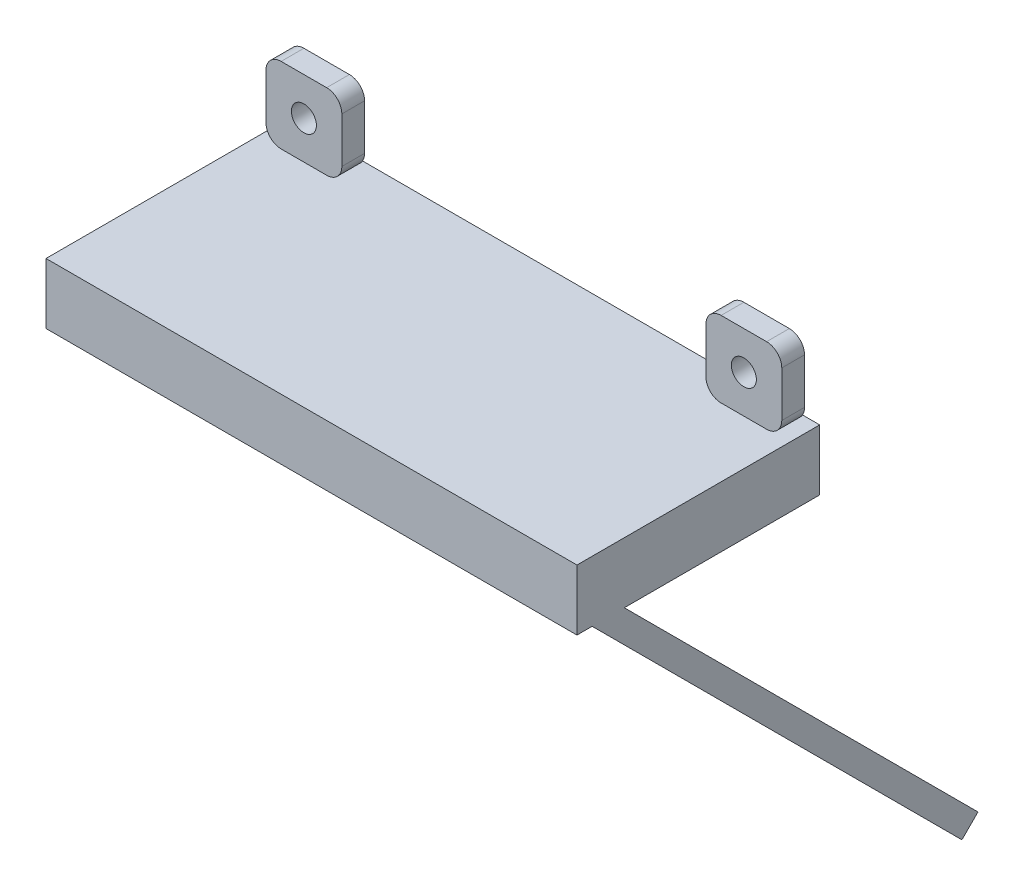
ISO-10303-21;
HEADER;
FILE_DESCRIPTION(('STEP AP214'),'2;1');
FILE_NAME('part.step','',(''),(''),'','','');
FILE_SCHEMA(('AUTOMOTIVE_DESIGN { 1 0 10303 214 1 1 1 1 }'));
ENDSEC;
DATA;
#1=APPLICATION_CONTEXT('core data for automotive mechanical design processes');
#2=APPLICATION_PROTOCOL_DEFINITION('international standard','automotive_design',2000,#1);
#3=PRODUCT_CONTEXT('',#1,'mechanical');
#4=PRODUCT('Part','Part','',(#3));
#5=PRODUCT_RELATED_PRODUCT_CATEGORY('part','',(#4));
#6=PRODUCT_DEFINITION_FORMATION('','',#4);
#7=PRODUCT_DEFINITION_CONTEXT('part definition',#1,'design');
#8=PRODUCT_DEFINITION('design','',#6,#7);
#9=PRODUCT_DEFINITION_SHAPE('','',#8);
#10=(LENGTH_UNIT() NAMED_UNIT(*) SI_UNIT(.MILLI.,.METRE.));
#11=(NAMED_UNIT(*) PLANE_ANGLE_UNIT() SI_UNIT($,.RADIAN.));
#12=(NAMED_UNIT(*) SI_UNIT($,.STERADIAN.) SOLID_ANGLE_UNIT());
#13=UNCERTAINTY_MEASURE_WITH_UNIT(LENGTH_MEASURE(1.E-05),#10,'distance_accuracy_value','');
#14=(GEOMETRIC_REPRESENTATION_CONTEXT(3) GLOBAL_UNCERTAINTY_ASSIGNED_CONTEXT((#13)) GLOBAL_UNIT_ASSIGNED_CONTEXT((#10,
#11,#12)) REPRESENTATION_CONTEXT('',''));
#15=CARTESIAN_POINT('',(0.,0.,0.));
#16=DIRECTION('',(0.,0.,1.));
#17=DIRECTION('',(1.,0.,0.));
#18=AXIS2_PLACEMENT_3D('',#15,#16,#17);
#19=CARTESIAN_POINT('',(-35.,-36.,34.));
#20=DIRECTION('',(0.,1.,0.));
#21=DIRECTION('',(0.,0.,1.));
#22=AXIS2_PLACEMENT_3D('',#19,#20,#21);
#23=PLANE('',#22);
#24=CARTESIAN_POINT('',(18.,-36.,17.9411254969543));
#25=DIRECTION('',(0.,1.,0.));
#26=DIRECTION('',(0.,0.,-1.));
#27=AXIS2_PLACEMENT_3D('',#24,#25,#26);
#28=ELLIPSE('',#27,4.52548339959391,3.2);
#29=CARTESIAN_POINT('',(20.5440188295439,-36.,20.6862915010153));
#30=VERTEX_POINT('',#29);
#31=CARTESIAN_POINT('',(15.4559811704561,-36.,20.6862915010153));
#32=VERTEX_POINT('',#31);
#33=EDGE_CURVE('E215',#30,#32,#28,.F.);
#34=ORIENTED_EDGE('',*,*,#33,.F.);
#35=DIRECTION('',(1.,0.,0.));
#36=VECTOR('',#35,1.);
#37=CARTESIAN_POINT('',(-35.,-36.,20.6862915010153));
#38=LINE('',#37,#36);
#39=EDGE_CURVE('E211',#32,#30,#38,.T.);
#40=ORIENTED_EDGE('',*,*,#39,.F.);
#41=EDGE_LOOP('',(#34,#40));
#42=FACE_BOUND('',#41,.T.);
#43=DIRECTION('',(0.,0.,-1.));
#44=VECTOR('',#43,1.);
#45=CARTESIAN_POINT('',(35.,-36.,34.));
#46=LINE('',#45,#44);
#47=CARTESIAN_POINT('',(35.,-36.,27.7573593128807));
#48=VERTEX_POINT('',#47);
#49=CARTESIAN_POINT('',(35.,-36.,2.));
#50=VERTEX_POINT('',#49);
#51=EDGE_CURVE('E271',#48,#50,#46,.T.);
#52=ORIENTED_EDGE('',*,*,#51,.F.);
#53=DIRECTION('',(-1.,0.,0.));
#54=VECTOR('',#53,1.);
#55=CARTESIAN_POINT('',(35.,-36.,27.7573593128807));
#56=LINE('',#55,#54);
#57=CARTESIAN_POINT('',(-35.,-36.,27.7573593128807));
#58=VERTEX_POINT('',#57);
#59=EDGE_CURVE('E255',#48,#58,#56,.T.);
#60=ORIENTED_EDGE('',*,*,#59,.T.);
#61=DIRECTION('',(0.,0.,-1.));
#62=VECTOR('',#61,1.);
#63=CARTESIAN_POINT('',(-35.,-36.,34.));
#64=LINE('',#63,#62);
#65=CARTESIAN_POINT('',(-35.,-36.,2.));
#66=VERTEX_POINT('',#65);
#67=EDGE_CURVE('E268',#58,#66,#64,.T.);
#68=ORIENTED_EDGE('',*,*,#67,.T.);
#69=DIRECTION('',(1.,0.,0.));
#70=VECTOR('',#69,1.);
#71=CARTESIAN_POINT('',(-35.,-36.,2.));
#72=LINE('',#71,#70);
#73=EDGE_CURVE('E284',#66,#50,#72,.T.);
#74=ORIENTED_EDGE('',*,*,#73,.T.);
#75=EDGE_LOOP('',(#52,#60,#68,#74));
#76=FACE_BOUND('',#75,.T.);
#77=CARTESIAN_POINT('',(-18.,-36.,17.9411254969543));
#78=DIRECTION('',(0.,1.,0.));
#79=DIRECTION('',(0.,0.,-1.));
#80=AXIS2_PLACEMENT_3D('',#77,#78,#79);
#81=ELLIPSE('',#80,4.5254833995939,3.2);
#82=CARTESIAN_POINT('',(-15.4559811704561,-36.,20.6862915010153));
#83=VERTEX_POINT('',#82);
#84=CARTESIAN_POINT('',(-20.5440188295439,-36.,20.6862915010153));
#85=VERTEX_POINT('',#84);
#86=EDGE_CURVE('E11',#83,#85,#81,.F.);
#87=ORIENTED_EDGE('',*,*,#86,.F.);
#88=DIRECTION('',(1.,0.,0.));
#89=VECTOR('',#88,1.);
#90=CARTESIAN_POINT('',(-35.,-36.,20.6862915010153));
#91=LINE('',#90,#89);
#92=EDGE_CURVE('E49',#85,#83,#91,.T.);
#93=ORIENTED_EDGE('',*,*,#92,.F.);
#94=EDGE_LOOP('',(#87,#93));
#95=FACE_BOUND('',#94,.T.);
#96=ADVANCED_FACE('F41',(#42,#76,#95),#23,.F.);
#97=CARTESIAN_POINT('',(35.,-28.,34.));
#98=DIRECTION('',(0.,-1.,0.));
#99=DIRECTION('',(0.,0.,-1.));
#100=AXIS2_PLACEMENT_3D('',#97,#98,#99);
#101=PLANE('',#100);
#102=DIRECTION('',(0.,0.,-1.));
#103=VECTOR('',#102,1.);
#104=CARTESIAN_POINT('',(-32.,-28.,6.));
#105=LINE('',#104,#103);
#106=CARTESIAN_POINT('',(-32.,-28.,6.));
#107=VERTEX_POINT('',#106);
#108=CARTESIAN_POINT('',(-32.,-28.,3.));
#109=VERTEX_POINT('',#108);
#110=EDGE_CURVE('E290',#107,#109,#105,.T.);
#111=ORIENTED_EDGE('',*,*,#110,.T.);
#112=DIRECTION('',(1.,0.,0.));
#113=VECTOR('',#112,1.);
#114=CARTESIAN_POINT('',(-32.,-28.,3.));
#115=LINE('',#114,#113);
#116=CARTESIAN_POINT('',(-26.,-28.,3.));
#117=VERTEX_POINT('',#116);
#118=EDGE_CURVE('E334',#109,#117,#115,.T.);
#119=ORIENTED_EDGE('',*,*,#118,.T.);
#120=DIRECTION('',(0.,0.,-1.));
#121=VECTOR('',#120,1.);
#122=CARTESIAN_POINT('',(-26.,-28.,6.));
#123=LINE('',#122,#121);
#124=CARTESIAN_POINT('',(-26.,-28.,6.));
#125=VERTEX_POINT('',#124);
#126=EDGE_CURVE('E300',#125,#117,#123,.T.);
#127=ORIENTED_EDGE('',*,*,#126,.F.);
#128=DIRECTION('',(1.,0.,0.));
#129=VECTOR('',#128,1.);
#130=CARTESIAN_POINT('',(-32.,-28.,6.));
#131=LINE('',#130,#129);
#132=EDGE_CURVE('E352',#107,#125,#131,.T.);
#133=ORIENTED_EDGE('',*,*,#132,.F.);
#134=EDGE_LOOP('',(#111,#119,#127,#133));
#135=FACE_BOUND('',#134,.T.);
#136=DIRECTION('',(-1.,0.,0.));
#137=VECTOR('',#136,1.);
#138=CARTESIAN_POINT('',(35.,-28.,2.));
#139=LINE('',#138,#137);
#140=CARTESIAN_POINT('',(35.,-28.,2.));
#141=VERTEX_POINT('',#140);
#142=CARTESIAN_POINT('',(-35.,-28.,2.));
#143=VERTEX_POINT('',#142);
#144=EDGE_CURVE('E279',#141,#143,#139,.T.);
#145=ORIENTED_EDGE('',*,*,#144,.T.);
#146=DIRECTION('',(0.,0.,-1.));
#147=VECTOR('',#146,1.);
#148=CARTESIAN_POINT('',(-35.,-28.,34.));
#149=LINE('',#148,#147);
#150=CARTESIAN_POINT('',(-35.,-28.,34.));
#151=VERTEX_POINT('',#150);
#152=EDGE_CURVE('E275',#151,#143,#149,.T.);
#153=ORIENTED_EDGE('',*,*,#152,.F.);
#154=DIRECTION('',(-1.,0.,0.));
#155=VECTOR('',#154,1.);
#156=CARTESIAN_POINT('',(35.,-28.,34.));
#157=LINE('',#156,#155);
#158=CARTESIAN_POINT('',(35.,-28.,34.));
#159=VERTEX_POINT('',#158);
#160=EDGE_CURVE('E278',#159,#151,#157,.T.);
#161=ORIENTED_EDGE('',*,*,#160,.F.);
#162=DIRECTION('',(0.,0.,-1.));
#163=VECTOR('',#162,1.);
#164=CARTESIAN_POINT('',(35.,-28.,34.));
#165=LINE('',#164,#163);
#166=EDGE_CURVE('E272',#159,#141,#165,.T.);
#167=ORIENTED_EDGE('',*,*,#166,.T.);
#168=EDGE_LOOP('',(#145,#153,#161,#167));
#169=FACE_BOUND('',#168,.T.);
#170=DIRECTION('',(0.,0.,-1.));
#171=VECTOR('',#170,1.);
#172=CARTESIAN_POINT('',(26.,-28.,6.));
#173=LINE('',#172,#171);
#174=CARTESIAN_POINT('',(26.,-28.,6.));
#175=VERTEX_POINT('',#174);
#176=CARTESIAN_POINT('',(26.,-28.,3.));
#177=VERTEX_POINT('',#176);
#178=EDGE_CURVE('E359',#175,#177,#173,.T.);
#179=ORIENTED_EDGE('',*,*,#178,.T.);
#180=DIRECTION('',(1.,0.,0.));
#181=VECTOR('',#180,1.);
#182=CARTESIAN_POINT('',(26.,-28.,3.));
#183=LINE('',#182,#181);
#184=CARTESIAN_POINT('',(32.,-28.,3.));
#185=VERTEX_POINT('',#184);
#186=EDGE_CURVE('E398',#177,#185,#183,.T.);
#187=ORIENTED_EDGE('',*,*,#186,.T.);
#188=DIRECTION('',(0.,0.,-1.));
#189=VECTOR('',#188,1.);
#190=CARTESIAN_POINT('',(32.,-28.,6.));
#191=LINE('',#190,#189);
#192=CARTESIAN_POINT('',(32.,-28.,6.));
#193=VERTEX_POINT('',#192);
#194=EDGE_CURVE('E364',#193,#185,#191,.T.);
#195=ORIENTED_EDGE('',*,*,#194,.F.);
#196=DIRECTION('',(1.,0.,0.));
#197=VECTOR('',#196,1.);
#198=CARTESIAN_POINT('',(26.,-28.,6.));
#199=LINE('',#198,#197);
#200=EDGE_CURVE('E416',#175,#193,#199,.T.);
#201=ORIENTED_EDGE('',*,*,#200,.F.);
#202=EDGE_LOOP('',(#179,#187,#195,#201));
#203=FACE_BOUND('',#202,.T.);
#204=ADVANCED_FACE('F457',(#135,#169,#203),#101,.F.);
#205=CARTESIAN_POINT('',(35.,-33.1299423149112,30.6274169979695));
#206=DIRECTION('',(0.,-0.707106781186548,0.707106781186548));
#207=DIRECTION('',(0.,-0.707106781186548,-0.707106781186548));
#208=AXIS2_PLACEMENT_3D('',#205,#206,#207);
#209=PLANE('',#208);
#210=CARTESIAN_POINT('',(-18.,-40.9081169079632,22.8492424049175));
#211=DIRECTION('',(0.,-0.707106781186548,0.707106781186548));
#212=DIRECTION('',(0.,-0.707106781186548,-0.707106781186548));
#213=AXIS2_PLACEMENT_3D('',#210,#211,#212);
#214=CIRCLE('',#213,1.65);
#215=CARTESIAN_POINT('',(-18.,-42.074843096921,21.6825162159597));
#216=VERTEX_POINT('',#215);
#217=EDGE_CURVE('E227',#216,#216,#214,.T.);
#218=ORIENTED_EDGE('',*,*,#217,.T.);
#219=EDGE_LOOP('',(#218));
#220=FACE_BOUND('',#219,.T.);
#221=CARTESIAN_POINT('',(18.,-74.8492424049175,-11.0918830920368));
#222=DIRECTION('',(0.,-0.707106781186548,0.707106781186548));
#223=DIRECTION('',(0.,-0.707106781186548,-0.707106781186548));
#224=AXIS2_PLACEMENT_3D('',#221,#222,#223);
#225=CIRCLE('',#224,1.65);
#226=CARTESIAN_POINT('',(18.,-76.0159685938753,-12.2586092809946));
#227=VERTEX_POINT('',#226);
#228=EDGE_CURVE('E228',#227,#227,#225,.T.);
#229=ORIENTED_EDGE('',*,*,#228,.T.);
#230=EDGE_LOOP('',(#229));
#231=FACE_BOUND('',#230,.T.);
#232=CARTESIAN_POINT('',(18.,-40.9081169079632,22.8492424049175));
#233=DIRECTION('',(0.,-0.707106781186548,0.707106781186548));
#234=DIRECTION('',(0.,-0.707106781186548,-0.707106781186548));
#235=AXIS2_PLACEMENT_3D('',#232,#233,#234);
#236=CIRCLE('',#235,1.65);
#237=CARTESIAN_POINT('',(18.,-42.074843096921,21.6825162159597));
#238=VERTEX_POINT('',#237);
#239=EDGE_CURVE('E232',#238,#238,#236,.T.);
#240=ORIENTED_EDGE('',*,*,#239,.T.);
#241=EDGE_LOOP('',(#240));
#242=FACE_BOUND('',#241,.T.);
#243=CARTESIAN_POINT('',(-18.,-74.8492424049175,-11.0918830920368));
#244=DIRECTION('',(0.,-0.707106781186548,0.707106781186548));
#245=DIRECTION('',(0.,-0.707106781186548,-0.707106781186548));
#246=AXIS2_PLACEMENT_3D('',#243,#244,#245);
#247=CIRCLE('',#246,1.65);
#248=CARTESIAN_POINT('',(-18.,-76.0159685938753,-12.2586092809946));
#249=VERTEX_POINT('',#248);
#250=EDGE_CURVE('E236',#249,#249,#247,.T.);
#251=ORIENTED_EDGE('',*,*,#250,.T.);
#252=EDGE_LOOP('',(#251));
#253=FACE_BOUND('',#252,.T.);
#254=ORIENTED_EDGE('',*,*,#59,.F.);
#255=DIRECTION('',(0.,0.707106781186548,0.707106781186548));
#256=VECTOR('',#255,1.);
#257=CARTESIAN_POINT('',(35.,-33.1299423149112,30.6274169979695));
#258=LINE('',#257,#256);
#259=CARTESIAN_POINT('',(35.,-82.6274169979695,-18.8700576850888));
#260=VERTEX_POINT('',#259);
#261=EDGE_CURVE('E257',#260,#48,#258,.T.);
#262=ORIENTED_EDGE('',*,*,#261,.F.);
#263=DIRECTION('',(-1.,0.,0.));
#264=VECTOR('',#263,1.);
#265=CARTESIAN_POINT('',(35.,-82.6274169979695,-18.8700576850888));
#266=LINE('',#265,#264);
#267=CARTESIAN_POINT('',(-35.,-82.6274169979695,-18.8700576850888));
#268=VERTEX_POINT('',#267);
#269=EDGE_CURVE('E216',#260,#268,#266,.T.);
#270=ORIENTED_EDGE('',*,*,#269,.T.);
#271=DIRECTION('',(0.,0.707106781186548,0.707106781186548));
#272=VECTOR('',#271,1.);
#273=CARTESIAN_POINT('',(-35.,-33.1299423149112,30.6274169979695));
#274=LINE('',#273,#272);
#275=EDGE_CURVE('E249',#268,#58,#274,.T.);
#276=ORIENTED_EDGE('',*,*,#275,.T.);
#277=EDGE_LOOP('',(#254,#262,#270,#276));
#278=FACE_BOUND('',#277,.T.);
#279=ADVANCED_FACE('F435',(#220,#231,#242,#253,#278),#209,.F.);
#280=CARTESIAN_POINT('',(35.,-84.7487373415292,-16.7487373415292));
#281=DIRECTION('',(0.,0.707106781186548,-0.707106781186548));
#282=DIRECTION('',(0.,0.707106781186548,0.707106781186548));
#283=AXIS2_PLACEMENT_3D('',#280,#281,#282);
#284=PLANE('',#283);
#285=CARTESIAN_POINT('',(-18.,-43.0294372515229,24.9705627484771));
#286=DIRECTION('',(0.,0.707106781186548,-0.707106781186548));
#287=DIRECTION('',(0.,0.707106781186548,0.707106781186548));
#288=AXIS2_PLACEMENT_3D('',#285,#286,#287);
#289=CIRCLE('',#288,1.65);
#290=CARTESIAN_POINT('',(-18.,-41.8627110625651,26.1372889374349));
#291=VERTEX_POINT('',#290);
#292=EDGE_CURVE('E224',#291,#291,#289,.T.);
#293=ORIENTED_EDGE('',*,*,#292,.T.);
#294=EDGE_LOOP('',(#293));
#295=FACE_BOUND('',#294,.T.);
#296=CARTESIAN_POINT('',(18.,-76.9705627484771,-8.97056274847713));
#297=DIRECTION('',(0.,0.707106781186548,-0.707106781186548));
#298=DIRECTION('',(0.,0.707106781186548,0.707106781186548));
#299=AXIS2_PLACEMENT_3D('',#296,#297,#298);
#300=CIRCLE('',#299,1.65);
#301=CARTESIAN_POINT('',(18.,-75.8038365595193,-7.80383655951933));
#302=VERTEX_POINT('',#301);
#303=EDGE_CURVE('E229',#302,#302,#300,.T.);
#304=ORIENTED_EDGE('',*,*,#303,.T.);
#305=EDGE_LOOP('',(#304));
#306=FACE_BOUND('',#305,.T.);
#307=CARTESIAN_POINT('',(18.,-43.0294372515229,24.9705627484771));
#308=DIRECTION('',(0.,0.707106781186548,-0.707106781186548));
#309=DIRECTION('',(0.,0.707106781186548,0.707106781186548));
#310=AXIS2_PLACEMENT_3D('',#307,#308,#309);
#311=CIRCLE('',#310,1.65);
#312=CARTESIAN_POINT('',(18.,-41.8627110625651,26.1372889374349));
#313=VERTEX_POINT('',#312);
#314=EDGE_CURVE('E233',#313,#313,#311,.T.);
#315=ORIENTED_EDGE('',*,*,#314,.T.);
#316=EDGE_LOOP('',(#315));
#317=FACE_BOUND('',#316,.T.);
#318=CARTESIAN_POINT('',(-18.,-76.9705627484771,-8.97056274847713));
#319=DIRECTION('',(0.,0.707106781186548,-0.707106781186548));
#320=DIRECTION('',(0.,0.707106781186548,0.707106781186548));
#321=AXIS2_PLACEMENT_3D('',#318,#319,#320);
#322=CIRCLE('',#321,1.65);
#323=CARTESIAN_POINT('',(-18.,-75.8038365595193,-7.80383655951933));
#324=VERTEX_POINT('',#323);
#325=EDGE_CURVE('E237',#324,#324,#322,.T.);
#326=ORIENTED_EDGE('',*,*,#325,.T.);
#327=EDGE_LOOP('',(#326));
#328=FACE_BOUND('',#327,.T.);
#329=DIRECTION('',(1.,0.,0.));
#330=VECTOR('',#329,1.);
#331=CARTESIAN_POINT('',(35.,-36.,32.));
#332=LINE('',#331,#330);
#333=CARTESIAN_POINT('',(-35.,-36.,32.));
#334=VERTEX_POINT('',#333);
#335=CARTESIAN_POINT('',(35.,-36.,32.));
#336=VERTEX_POINT('',#335);
#337=EDGE_CURVE('E263',#334,#336,#332,.T.);
#338=ORIENTED_EDGE('',*,*,#337,.F.);
#339=DIRECTION('',(0.,-0.707106781186548,-0.707106781186548));
#340=VECTOR('',#339,1.);
#341=CARTESIAN_POINT('',(-35.,-84.7487373415292,-16.7487373415292));
#342=LINE('',#341,#340);
#343=CARTESIAN_POINT('',(-35.,-84.7487373415292,-16.7487373415292));
#344=VERTEX_POINT('',#343);
#345=EDGE_CURVE('E246',#334,#344,#342,.T.);
#346=ORIENTED_EDGE('',*,*,#345,.T.);
#347=DIRECTION('',(-1.,0.,0.));
#348=VECTOR('',#347,1.);
#349=CARTESIAN_POINT('',(35.,-84.7487373415292,-16.7487373415292));
#350=LINE('',#349,#348);
#351=CARTESIAN_POINT('',(35.,-84.7487373415292,-16.7487373415292));
#352=VERTEX_POINT('',#351);
#353=EDGE_CURVE('E242',#352,#344,#350,.T.);
#354=ORIENTED_EDGE('',*,*,#353,.F.);
#355=DIRECTION('',(0.,-0.707106781186548,-0.707106781186548));
#356=VECTOR('',#355,1.);
#357=CARTESIAN_POINT('',(35.,-84.7487373415292,-16.7487373415292));
#358=LINE('',#357,#356);
#359=EDGE_CURVE('E245',#336,#352,#358,.T.);
#360=ORIENTED_EDGE('',*,*,#359,.F.);
#361=EDGE_LOOP('',(#338,#346,#354,#360));
#362=FACE_BOUND('',#361,.T.);
#363=ADVANCED_FACE('F487',(#295,#306,#317,#328,#362),#284,.F.);
#364=CARTESIAN_POINT('',(35.,-82.6274169979695,-18.8700576850888));
#365=DIRECTION('',(0.,0.707106781186546,0.707106781186549));
#366=DIRECTION('',(0.,-0.707106781186549,0.707106781186546));
#367=AXIS2_PLACEMENT_3D('',#364,#365,#366);
#368=PLANE('',#367);
#369=DIRECTION('',(0.,0.707106781186549,-0.707106781186546));
#370=VECTOR('',#369,1.);
#371=CARTESIAN_POINT('',(-35.,-82.6274169979695,-18.8700576850888));
#372=LINE('',#371,#370);
#373=EDGE_CURVE('E252',#344,#268,#372,.T.);
#374=ORIENTED_EDGE('',*,*,#373,.T.);
#375=ORIENTED_EDGE('',*,*,#269,.F.);
#376=DIRECTION('',(0.,0.707106781186549,-0.707106781186546));
#377=VECTOR('',#376,1.);
#378=CARTESIAN_POINT('',(35.,-82.6274169979695,-18.8700576850888));
#379=LINE('',#378,#377);
#380=EDGE_CURVE('E248',#352,#260,#379,.T.);
#381=ORIENTED_EDGE('',*,*,#380,.F.);
#382=ORIENTED_EDGE('',*,*,#353,.T.);
#383=EDGE_LOOP('',(#374,#375,#381,#382));
#384=FACE_BOUND('',#383,.T.);
#385=ADVANCED_FACE('F43',(#384),#368,.F.);
#386=CARTESIAN_POINT('',(35.,0.,0.));
#387=DIRECTION('',(-1.,0.,0.));
#388=DIRECTION('',(0.,0.,1.));
#389=AXIS2_PLACEMENT_3D('',#386,#387,#388);
#390=PLANE('',#389);
#391=ORIENTED_EDGE('',*,*,#261,.T.);
#392=ORIENTED_EDGE('',*,*,#51,.T.);
#393=DIRECTION('',(0.,1.,0.));
#394=VECTOR('',#393,1.);
#395=CARTESIAN_POINT('',(35.,-36.,2.));
#396=LINE('',#395,#394);
#397=EDGE_CURVE('E282',#50,#141,#396,.T.);
#398=ORIENTED_EDGE('',*,*,#397,.T.);
#399=ORIENTED_EDGE('',*,*,#166,.F.);
#400=DIRECTION('',(0.,1.,0.));
#401=VECTOR('',#400,1.);
#402=CARTESIAN_POINT('',(35.,-36.,34.));
#403=LINE('',#402,#401);
#404=CARTESIAN_POINT('',(35.,-36.,34.));
#405=VERTEX_POINT('',#404);
#406=EDGE_CURVE('E292',#405,#159,#403,.T.);
#407=ORIENTED_EDGE('',*,*,#406,.F.);
#408=EDGE_CURVE('E269',#405,#336,#46,.T.);
#409=ORIENTED_EDGE('',*,*,#408,.T.);
#410=ORIENTED_EDGE('',*,*,#359,.T.);
#411=ORIENTED_EDGE('',*,*,#380,.T.);
#412=EDGE_LOOP('',(#391,#392,#398,#399,#407,#409,#410,#411));
#413=FACE_BOUND('',#412,.T.);
#414=ADVANCED_FACE('F477',(#413),#390,.F.);
#415=CARTESIAN_POINT('',(-35.,0.,0.));
#416=DIRECTION('',(-1.,0.,0.));
#417=DIRECTION('',(0.,0.,1.));
#418=AXIS2_PLACEMENT_3D('',#415,#416,#417);
#419=PLANE('',#418);
#420=ORIENTED_EDGE('',*,*,#67,.F.);
#421=ORIENTED_EDGE('',*,*,#275,.F.);
#422=ORIENTED_EDGE('',*,*,#373,.F.);
#423=ORIENTED_EDGE('',*,*,#345,.F.);
#424=CARTESIAN_POINT('',(-35.,-36.,34.));
#425=VERTEX_POINT('',#424);
#426=EDGE_CURVE('E266',#425,#334,#64,.T.);
#427=ORIENTED_EDGE('',*,*,#426,.F.);
#428=DIRECTION('',(0.,-1.,0.));
#429=VECTOR('',#428,1.);
#430=CARTESIAN_POINT('',(-35.,-28.,34.));
#431=LINE('',#430,#429);
#432=EDGE_CURVE('E281',#151,#425,#431,.T.);
#433=ORIENTED_EDGE('',*,*,#432,.F.);
#434=ORIENTED_EDGE('',*,*,#152,.T.);
#435=DIRECTION('',(0.,-1.,0.));
#436=VECTOR('',#435,1.);
#437=CARTESIAN_POINT('',(-35.,-28.,2.));
#438=LINE('',#437,#436);
#439=EDGE_CURVE('E287',#143,#66,#438,.T.);
#440=ORIENTED_EDGE('',*,*,#439,.T.);
#441=EDGE_LOOP('',(#420,#421,#422,#423,#427,#433,#434,#440));
#442=FACE_BOUND('',#441,.T.);
#443=ADVANCED_FACE('F468',(#442),#419,.T.);
#444=ORIENTED_EDGE('',*,*,#426,.T.);
#445=ORIENTED_EDGE('',*,*,#337,.T.);
#446=ORIENTED_EDGE('',*,*,#408,.F.);
#447=DIRECTION('',(1.,0.,0.));
#448=VECTOR('',#447,1.);
#449=CARTESIAN_POINT('',(-35.,-36.,34.));
#450=LINE('',#449,#448);
#451=EDGE_CURVE('E294',#425,#405,#450,.T.);
#452=ORIENTED_EDGE('',*,*,#451,.F.);
#453=EDGE_LOOP('',(#444,#445,#446,#452));
#454=FACE_BOUND('',#453,.T.);
#455=ADVANCED_FACE('F459',(#454),#23,.F.);
#456=CARTESIAN_POINT('',(0.,0.,34.));
#457=DIRECTION('',(0.,0.,1.));
#458=DIRECTION('',(1.,0.,0.));
#459=AXIS2_PLACEMENT_3D('',#456,#457,#458);
#460=PLANE('',#459);
#461=ORIENTED_EDGE('',*,*,#432,.T.);
#462=ORIENTED_EDGE('',*,*,#451,.T.);
#463=ORIENTED_EDGE('',*,*,#406,.T.);
#464=ORIENTED_EDGE('',*,*,#160,.T.);
#465=EDGE_LOOP('',(#461,#462,#463,#464));
#466=FACE_BOUND('',#465,.T.);
#467=ADVANCED_FACE('F467',(#466),#460,.T.);
#468=CARTESIAN_POINT('',(0.,0.,2.));
#469=DIRECTION('',(0.,0.,1.));
#470=DIRECTION('',(1.,0.,0.));
#471=AXIS2_PLACEMENT_3D('',#468,#469,#470);
#472=PLANE('',#471);
#473=ORIENTED_EDGE('',*,*,#439,.F.);
#474=ORIENTED_EDGE('',*,*,#144,.F.);
#475=ORIENTED_EDGE('',*,*,#397,.F.);
#476=ORIENTED_EDGE('',*,*,#73,.F.);
#477=EDGE_LOOP('',(#473,#474,#475,#476));
#478=FACE_BOUND('',#477,.T.);
#479=ADVANCED_FACE('F474',(#478),#472,.F.);
#480=CARTESIAN_POINT('',(-32.,-26.,6.));
#481=DIRECTION('',(0.,0.,1.));
#482=DIRECTION('',(1.,0.,0.));
#483=AXIS2_PLACEMENT_3D('',#480,#481,#482);
#484=PLANE('',#483);
#485=CARTESIAN_POINT('',(-32.,-26.,6.));
#486=DIRECTION('',(0.,0.,1.));
#487=DIRECTION('',(1.,0.,0.));
#488=AXIS2_PLACEMENT_3D('',#485,#486,#487);
#489=CIRCLE('',#488,2.);
#490=CARTESIAN_POINT('',(-34.,-26.,6.));
#491=VERTEX_POINT('',#490);
#492=EDGE_CURVE('E323',#491,#107,#489,.T.);
#493=ORIENTED_EDGE('',*,*,#492,.T.);
#494=ORIENTED_EDGE('',*,*,#132,.T.);
#495=CARTESIAN_POINT('',(-26.,-26.,6.));
#496=DIRECTION('',(0.,0.,1.));
#497=DIRECTION('',(1.,0.,0.));
#498=AXIS2_PLACEMENT_3D('',#495,#496,#497);
#499=CIRCLE('',#498,2.);
#500=CARTESIAN_POINT('',(-24.,-26.,6.));
#501=VERTEX_POINT('',#500);
#502=EDGE_CURVE('E350',#125,#501,#499,.T.);
#503=ORIENTED_EDGE('',*,*,#502,.T.);
#504=DIRECTION('',(0.,1.,0.));
#505=VECTOR('',#504,1.);
#506=CARTESIAN_POINT('',(-24.,-26.,6.));
#507=LINE('',#506,#505);
#508=CARTESIAN_POINT('',(-24.,-20.,6.));
#509=VERTEX_POINT('',#508);
#510=EDGE_CURVE('E348',#501,#509,#507,.T.);
#511=ORIENTED_EDGE('',*,*,#510,.T.);
#512=CARTESIAN_POINT('',(-26.,-20.,6.));
#513=DIRECTION('',(0.,0.,1.));
#514=DIRECTION('',(1.,0.,0.));
#515=AXIS2_PLACEMENT_3D('',#512,#513,#514);
#516=CIRCLE('',#515,2.);
#517=CARTESIAN_POINT('',(-26.,-18.,6.));
#518=VERTEX_POINT('',#517);
#519=EDGE_CURVE('E346',#509,#518,#516,.T.);
#520=ORIENTED_EDGE('',*,*,#519,.T.);
#521=DIRECTION('',(-1.,0.,0.));
#522=VECTOR('',#521,1.);
#523=CARTESIAN_POINT('',(-26.,-18.,6.));
#524=LINE('',#523,#522);
#525=CARTESIAN_POINT('',(-32.,-18.,6.));
#526=VERTEX_POINT('',#525);
#527=EDGE_CURVE('E344',#518,#526,#524,.T.);
#528=ORIENTED_EDGE('',*,*,#527,.T.);
#529=CARTESIAN_POINT('',(-32.,-20.,6.));
#530=DIRECTION('',(0.,0.,1.));
#531=DIRECTION('',(1.,0.,0.));
#532=AXIS2_PLACEMENT_3D('',#529,#530,#531);
#533=CIRCLE('',#532,2.);
#534=CARTESIAN_POINT('',(-34.,-20.,6.));
#535=VERTEX_POINT('',#534);
#536=EDGE_CURVE('E342',#526,#535,#533,.T.);
#537=ORIENTED_EDGE('',*,*,#536,.T.);
#538=DIRECTION('',(0.,-1.,0.));
#539=VECTOR('',#538,1.);
#540=CARTESIAN_POINT('',(-34.,-20.,6.));
#541=LINE('',#540,#539);
#542=EDGE_CURVE('E320',#535,#491,#541,.T.);
#543=ORIENTED_EDGE('',*,*,#542,.T.);
#544=EDGE_LOOP('',(#493,#494,#503,#511,#520,#528,#537,#543));
#545=FACE_BOUND('',#544,.T.);
#546=CARTESIAN_POINT('',(-29.,-23.,6.));
#547=DIRECTION('',(0.,0.,1.));
#548=DIRECTION('',(1.,0.,0.));
#549=AXIS2_PLACEMENT_3D('',#546,#547,#548);
#550=CIRCLE('',#549,1.65);
#551=CARTESIAN_POINT('',(-27.35,-23.,6.));
#552=VERTEX_POINT('',#551);
#553=EDGE_CURVE('E340',#552,#552,#550,.T.);
#554=ORIENTED_EDGE('',*,*,#553,.F.);
#555=EDGE_LOOP('',(#554));
#556=FACE_BOUND('',#555,.T.);
#557=ADVANCED_FACE('F804',(#545,#556),#484,.T.);
#558=CARTESIAN_POINT('',(-32.,-26.,3.));
#559=DIRECTION('',(0.,0.,1.));
#560=DIRECTION('',(1.,0.,0.));
#561=AXIS2_PLACEMENT_3D('',#558,#559,#560);
#562=PLANE('',#561);
#563=CARTESIAN_POINT('',(-32.,-26.,3.));
#564=DIRECTION('',(0.,0.,1.));
#565=DIRECTION('',(1.,0.,0.));
#566=AXIS2_PLACEMENT_3D('',#563,#564,#565);
#567=CIRCLE('',#566,2.);
#568=CARTESIAN_POINT('',(-34.,-26.,3.));
#569=VERTEX_POINT('',#568);
#570=EDGE_CURVE('E337',#569,#109,#567,.T.);
#571=ORIENTED_EDGE('',*,*,#570,.F.);
#572=DIRECTION('',(0.,-1.,0.));
#573=VECTOR('',#572,1.);
#574=CARTESIAN_POINT('',(-34.,-20.,3.));
#575=LINE('',#574,#573);
#576=CARTESIAN_POINT('',(-34.,-20.,3.));
#577=VERTEX_POINT('',#576);
#578=EDGE_CURVE('E321',#577,#569,#575,.T.);
#579=ORIENTED_EDGE('',*,*,#578,.F.);
#580=CARTESIAN_POINT('',(-32.,-20.,3.));
#581=DIRECTION('',(0.,0.,1.));
#582=DIRECTION('',(1.,0.,0.));
#583=AXIS2_PLACEMENT_3D('',#580,#581,#582);
#584=CIRCLE('',#583,2.);
#585=CARTESIAN_POINT('',(-32.,-18.,3.));
#586=VERTEX_POINT('',#585);
#587=EDGE_CURVE('E324',#586,#577,#584,.T.);
#588=ORIENTED_EDGE('',*,*,#587,.F.);
#589=DIRECTION('',(-1.,0.,0.));
#590=VECTOR('',#589,1.);
#591=CARTESIAN_POINT('',(-26.,-18.,3.));
#592=LINE('',#591,#590);
#593=CARTESIAN_POINT('',(-26.,-18.,3.));
#594=VERTEX_POINT('',#593);
#595=EDGE_CURVE('E326',#594,#586,#592,.T.);
#596=ORIENTED_EDGE('',*,*,#595,.F.);
#597=CARTESIAN_POINT('',(-26.,-20.,3.));
#598=DIRECTION('',(0.,0.,1.));
#599=DIRECTION('',(1.,0.,0.));
#600=AXIS2_PLACEMENT_3D('',#597,#598,#599);
#601=CIRCLE('',#600,2.);
#602=CARTESIAN_POINT('',(-24.,-20.,3.));
#603=VERTEX_POINT('',#602);
#604=EDGE_CURVE('E328',#603,#594,#601,.T.);
#605=ORIENTED_EDGE('',*,*,#604,.F.);
#606=DIRECTION('',(0.,1.,0.));
#607=VECTOR('',#606,1.);
#608=CARTESIAN_POINT('',(-24.,-26.,3.));
#609=LINE('',#608,#607);
#610=CARTESIAN_POINT('',(-24.,-26.,3.));
#611=VERTEX_POINT('',#610);
#612=EDGE_CURVE('E330',#611,#603,#609,.T.);
#613=ORIENTED_EDGE('',*,*,#612,.F.);
#614=CARTESIAN_POINT('',(-26.,-26.,3.));
#615=DIRECTION('',(0.,0.,1.));
#616=DIRECTION('',(1.,0.,0.));
#617=AXIS2_PLACEMENT_3D('',#614,#615,#616);
#618=CIRCLE('',#617,2.);
#619=EDGE_CURVE('E332',#117,#611,#618,.T.);
#620=ORIENTED_EDGE('',*,*,#619,.F.);
#621=ORIENTED_EDGE('',*,*,#118,.F.);
#622=EDGE_LOOP('',(#571,#579,#588,#596,#605,#613,#620,#621));
#623=FACE_BOUND('',#622,.T.);
#624=CARTESIAN_POINT('',(-29.,-23.,3.));
#625=DIRECTION('',(0.,0.,1.));
#626=DIRECTION('',(1.,0.,0.));
#627=AXIS2_PLACEMENT_3D('',#624,#625,#626);
#628=CIRCLE('',#627,1.65);
#629=CARTESIAN_POINT('',(-27.35,-23.,3.));
#630=VERTEX_POINT('',#629);
#631=EDGE_CURVE('E356',#630,#630,#628,.T.);
#632=ORIENTED_EDGE('',*,*,#631,.T.);
#633=EDGE_LOOP('',(#632));
#634=FACE_BOUND('',#633,.T.);
#635=ADVANCED_FACE('F794',(#623,#634),#562,.F.);
#636=CARTESIAN_POINT('',(-32.,-26.,6.));
#637=DIRECTION('',(0.,0.,-1.));
#638=DIRECTION('',(-1.,0.,0.));
#639=AXIS2_PLACEMENT_3D('',#636,#637,#638);
#640=CYLINDRICAL_SURFACE('',#639,2.);
#641=ORIENTED_EDGE('',*,*,#570,.T.);
#642=ORIENTED_EDGE('',*,*,#110,.F.);
#643=ORIENTED_EDGE('',*,*,#492,.F.);
#644=DIRECTION('',(0.,0.,-1.));
#645=VECTOR('',#644,1.);
#646=CARTESIAN_POINT('',(-34.,-26.,6.));
#647=LINE('',#646,#645);
#648=EDGE_CURVE('E317',#491,#569,#647,.T.);
#649=ORIENTED_EDGE('',*,*,#648,.T.);
#650=EDGE_LOOP('',(#641,#642,#643,#649));
#651=FACE_BOUND('',#650,.T.);
#652=ADVANCED_FACE('F784',(#651),#640,.T.);
#653=CARTESIAN_POINT('',(-26.,-26.,6.));
#654=DIRECTION('',(0.,0.,-1.));
#655=DIRECTION('',(-1.,0.,0.));
#656=AXIS2_PLACEMENT_3D('',#653,#654,#655);
#657=CYLINDRICAL_SURFACE('',#656,2.);
#658=ORIENTED_EDGE('',*,*,#619,.T.);
#659=DIRECTION('',(0.,0.,-1.));
#660=VECTOR('',#659,1.);
#661=CARTESIAN_POINT('',(-24.,-26.,6.));
#662=LINE('',#661,#660);
#663=EDGE_CURVE('E302',#501,#611,#662,.T.);
#664=ORIENTED_EDGE('',*,*,#663,.F.);
#665=ORIENTED_EDGE('',*,*,#502,.F.);
#666=ORIENTED_EDGE('',*,*,#126,.T.);
#667=EDGE_LOOP('',(#658,#664,#665,#666));
#668=FACE_BOUND('',#667,.T.);
#669=ADVANCED_FACE('F774',(#668),#657,.T.);
#670=CARTESIAN_POINT('',(-24.,-26.,6.));
#671=DIRECTION('',(-1.,0.,0.));
#672=DIRECTION('',(0.,0.,1.));
#673=AXIS2_PLACEMENT_3D('',#670,#671,#672);
#674=PLANE('',#673);
#675=ORIENTED_EDGE('',*,*,#612,.T.);
#676=DIRECTION('',(0.,0.,-1.));
#677=VECTOR('',#676,1.);
#678=CARTESIAN_POINT('',(-24.,-20.,6.));
#679=LINE('',#678,#677);
#680=EDGE_CURVE('E305',#509,#603,#679,.T.);
#681=ORIENTED_EDGE('',*,*,#680,.F.);
#682=ORIENTED_EDGE('',*,*,#510,.F.);
#683=ORIENTED_EDGE('',*,*,#663,.T.);
#684=EDGE_LOOP('',(#675,#681,#682,#683));
#685=FACE_BOUND('',#684,.T.);
#686=ADVANCED_FACE('F764',(#685),#674,.F.);
#687=CARTESIAN_POINT('',(-26.,-20.,6.));
#688=DIRECTION('',(0.,0.,-1.));
#689=DIRECTION('',(-1.,0.,0.));
#690=AXIS2_PLACEMENT_3D('',#687,#688,#689);
#691=CYLINDRICAL_SURFACE('',#690,2.);
#692=ORIENTED_EDGE('',*,*,#604,.T.);
#693=DIRECTION('',(0.,0.,-1.));
#694=VECTOR('',#693,1.);
#695=CARTESIAN_POINT('',(-26.,-18.,6.));
#696=LINE('',#695,#694);
#697=EDGE_CURVE('E308',#518,#594,#696,.T.);
#698=ORIENTED_EDGE('',*,*,#697,.F.);
#699=ORIENTED_EDGE('',*,*,#519,.F.);
#700=ORIENTED_EDGE('',*,*,#680,.T.);
#701=EDGE_LOOP('',(#692,#698,#699,#700));
#702=FACE_BOUND('',#701,.T.);
#703=ADVANCED_FACE('F754',(#702),#691,.T.);
#704=CARTESIAN_POINT('',(-26.,-18.,6.));
#705=DIRECTION('',(0.,-1.,0.));
#706=DIRECTION('',(0.,0.,-1.));
#707=AXIS2_PLACEMENT_3D('',#704,#705,#706);
#708=PLANE('',#707);
#709=ORIENTED_EDGE('',*,*,#595,.T.);
#710=DIRECTION('',(0.,0.,-1.));
#711=VECTOR('',#710,1.);
#712=CARTESIAN_POINT('',(-32.,-18.,6.));
#713=LINE('',#712,#711);
#714=EDGE_CURVE('E311',#526,#586,#713,.T.);
#715=ORIENTED_EDGE('',*,*,#714,.F.);
#716=ORIENTED_EDGE('',*,*,#527,.F.);
#717=ORIENTED_EDGE('',*,*,#697,.T.);
#718=EDGE_LOOP('',(#709,#715,#716,#717));
#719=FACE_BOUND('',#718,.T.);
#720=ADVANCED_FACE('F744',(#719),#708,.F.);
#721=CARTESIAN_POINT('',(-32.,-20.,6.));
#722=DIRECTION('',(0.,0.,-1.));
#723=DIRECTION('',(-1.,0.,0.));
#724=AXIS2_PLACEMENT_3D('',#721,#722,#723);
#725=CYLINDRICAL_SURFACE('',#724,2.);
#726=ORIENTED_EDGE('',*,*,#587,.T.);
#727=DIRECTION('',(0.,0.,-1.));
#728=VECTOR('',#727,1.);
#729=CARTESIAN_POINT('',(-34.,-20.,6.));
#730=LINE('',#729,#728);
#731=EDGE_CURVE('E314',#535,#577,#730,.T.);
#732=ORIENTED_EDGE('',*,*,#731,.F.);
#733=ORIENTED_EDGE('',*,*,#536,.F.);
#734=ORIENTED_EDGE('',*,*,#714,.T.);
#735=EDGE_LOOP('',(#726,#732,#733,#734));
#736=FACE_BOUND('',#735,.T.);
#737=ADVANCED_FACE('F734',(#736),#725,.T.);
#738=CARTESIAN_POINT('',(-34.,-20.,6.));
#739=DIRECTION('',(1.,0.,0.));
#740=DIRECTION('',(0.,0.,-1.));
#741=AXIS2_PLACEMENT_3D('',#738,#739,#740);
#742=PLANE('',#741);
#743=ORIENTED_EDGE('',*,*,#578,.T.);
#744=ORIENTED_EDGE('',*,*,#648,.F.);
#745=ORIENTED_EDGE('',*,*,#542,.F.);
#746=ORIENTED_EDGE('',*,*,#731,.T.);
#747=EDGE_LOOP('',(#743,#744,#745,#746));
#748=FACE_BOUND('',#747,.T.);
#749=ADVANCED_FACE('F724',(#748),#742,.F.);
#750=CARTESIAN_POINT('',(-29.,-23.,6.));
#751=DIRECTION('',(0.,0.,-1.));
#752=DIRECTION('',(-1.,0.,0.));
#753=AXIS2_PLACEMENT_3D('',#750,#751,#752);
#754=CYLINDRICAL_SURFACE('',#753,1.65);
#755=ORIENTED_EDGE('',*,*,#553,.T.);
#756=EDGE_LOOP('',(#755));
#757=FACE_BOUND('',#756,.T.);
#758=ORIENTED_EDGE('',*,*,#631,.F.);
#759=EDGE_LOOP('',(#758));
#760=FACE_BOUND('',#759,.T.);
#761=ADVANCED_FACE('F708',(#757,#760),#754,.F.);
#762=CARTESIAN_POINT('',(26.,-26.,6.));
#763=DIRECTION('',(0.,0.,1.));
#764=DIRECTION('',(1.,0.,0.));
#765=AXIS2_PLACEMENT_3D('',#762,#763,#764);
#766=PLANE('',#765);
#767=CARTESIAN_POINT('',(26.,-26.,6.));
#768=DIRECTION('',(0.,0.,1.));
#769=DIRECTION('',(1.,0.,0.));
#770=AXIS2_PLACEMENT_3D('',#767,#768,#769);
#771=CIRCLE('',#770,2.);
#772=CARTESIAN_POINT('',(24.,-26.,6.));
#773=VERTEX_POINT('',#772);
#774=EDGE_CURVE('E387',#773,#175,#771,.T.);
#775=ORIENTED_EDGE('',*,*,#774,.T.);
#776=ORIENTED_EDGE('',*,*,#200,.T.);
#777=CARTESIAN_POINT('',(32.,-26.,6.));
#778=DIRECTION('',(0.,0.,1.));
#779=DIRECTION('',(1.,0.,0.));
#780=AXIS2_PLACEMENT_3D('',#777,#778,#779);
#781=CIRCLE('',#780,2.);
#782=CARTESIAN_POINT('',(34.,-26.,6.));
#783=VERTEX_POINT('',#782);
#784=EDGE_CURVE('E414',#193,#783,#781,.T.);
#785=ORIENTED_EDGE('',*,*,#784,.T.);
#786=DIRECTION('',(0.,1.,0.));
#787=VECTOR('',#786,1.);
#788=CARTESIAN_POINT('',(34.,-26.,6.));
#789=LINE('',#788,#787);
#790=CARTESIAN_POINT('',(34.,-20.,6.));
#791=VERTEX_POINT('',#790);
#792=EDGE_CURVE('E412',#783,#791,#789,.T.);
#793=ORIENTED_EDGE('',*,*,#792,.T.);
#794=CARTESIAN_POINT('',(32.,-20.,6.));
#795=DIRECTION('',(0.,0.,1.));
#796=DIRECTION('',(1.,0.,0.));
#797=AXIS2_PLACEMENT_3D('',#794,#795,#796);
#798=CIRCLE('',#797,2.);
#799=CARTESIAN_POINT('',(32.,-18.,6.));
#800=VERTEX_POINT('',#799);
#801=EDGE_CURVE('E410',#791,#800,#798,.T.);
#802=ORIENTED_EDGE('',*,*,#801,.T.);
#803=DIRECTION('',(-1.,0.,0.));
#804=VECTOR('',#803,1.);
#805=CARTESIAN_POINT('',(32.,-18.,6.));
#806=LINE('',#805,#804);
#807=CARTESIAN_POINT('',(26.,-18.,6.));
#808=VERTEX_POINT('',#807);
#809=EDGE_CURVE('E408',#800,#808,#806,.T.);
#810=ORIENTED_EDGE('',*,*,#809,.T.);
#811=CARTESIAN_POINT('',(26.,-20.,6.));
#812=DIRECTION('',(0.,0.,1.));
#813=DIRECTION('',(1.,0.,0.));
#814=AXIS2_PLACEMENT_3D('',#811,#812,#813);
#815=CIRCLE('',#814,2.);
#816=CARTESIAN_POINT('',(24.,-20.,6.));
#817=VERTEX_POINT('',#816);
#818=EDGE_CURVE('E406',#808,#817,#815,.T.);
#819=ORIENTED_EDGE('',*,*,#818,.T.);
#820=DIRECTION('',(0.,-1.,0.));
#821=VECTOR('',#820,1.);
#822=CARTESIAN_POINT('',(24.,-20.,6.));
#823=LINE('',#822,#821);
#824=EDGE_CURVE('E384',#817,#773,#823,.T.);
#825=ORIENTED_EDGE('',*,*,#824,.T.);
#826=EDGE_LOOP('',(#775,#776,#785,#793,#802,#810,#819,#825));
#827=FACE_BOUND('',#826,.T.);
#828=CARTESIAN_POINT('',(29.,-23.,6.));
#829=DIRECTION('',(0.,0.,1.));
#830=DIRECTION('',(1.,0.,0.));
#831=AXIS2_PLACEMENT_3D('',#828,#829,#830);
#832=CIRCLE('',#831,1.65);
#833=CARTESIAN_POINT('',(30.65,-23.,6.));
#834=VERTEX_POINT('',#833);
#835=EDGE_CURVE('E404',#834,#834,#832,.T.);
#836=ORIENTED_EDGE('',*,*,#835,.F.);
#837=EDGE_LOOP('',(#836));
#838=FACE_BOUND('',#837,.T.);
#839=ADVANCED_FACE('F698',(#827,#838),#766,.T.);
#840=CARTESIAN_POINT('',(26.,-26.,3.));
#841=DIRECTION('',(0.,0.,1.));
#842=DIRECTION('',(1.,0.,0.));
#843=AXIS2_PLACEMENT_3D('',#840,#841,#842);
#844=PLANE('',#843);
#845=CARTESIAN_POINT('',(26.,-26.,3.));
#846=DIRECTION('',(0.,0.,1.));
#847=DIRECTION('',(1.,0.,0.));
#848=AXIS2_PLACEMENT_3D('',#845,#846,#847);
#849=CIRCLE('',#848,2.);
#850=CARTESIAN_POINT('',(24.,-26.,3.));
#851=VERTEX_POINT('',#850);
#852=EDGE_CURVE('E401',#851,#177,#849,.T.);
#853=ORIENTED_EDGE('',*,*,#852,.F.);
#854=DIRECTION('',(0.,-1.,0.));
#855=VECTOR('',#854,1.);
#856=CARTESIAN_POINT('',(24.,-20.,3.));
#857=LINE('',#856,#855);
#858=CARTESIAN_POINT('',(24.,-20.,3.));
#859=VERTEX_POINT('',#858);
#860=EDGE_CURVE('E385',#859,#851,#857,.T.);
#861=ORIENTED_EDGE('',*,*,#860,.F.);
#862=CARTESIAN_POINT('',(26.,-20.,3.));
#863=DIRECTION('',(0.,0.,1.));
#864=DIRECTION('',(1.,0.,0.));
#865=AXIS2_PLACEMENT_3D('',#862,#863,#864);
#866=CIRCLE('',#865,2.);
#867=CARTESIAN_POINT('',(26.,-18.,3.));
#868=VERTEX_POINT('',#867);
#869=EDGE_CURVE('E388',#868,#859,#866,.T.);
#870=ORIENTED_EDGE('',*,*,#869,.F.);
#871=DIRECTION('',(-1.,0.,0.));
#872=VECTOR('',#871,1.);
#873=CARTESIAN_POINT('',(32.,-18.,3.));
#874=LINE('',#873,#872);
#875=CARTESIAN_POINT('',(32.,-18.,3.));
#876=VERTEX_POINT('',#875);
#877=EDGE_CURVE('E390',#876,#868,#874,.T.);
#878=ORIENTED_EDGE('',*,*,#877,.F.);
#879=CARTESIAN_POINT('',(32.,-20.,3.));
#880=DIRECTION('',(0.,0.,1.));
#881=DIRECTION('',(1.,0.,0.));
#882=AXIS2_PLACEMENT_3D('',#879,#880,#881);
#883=CIRCLE('',#882,2.);
#884=CARTESIAN_POINT('',(34.,-20.,3.));
#885=VERTEX_POINT('',#884);
#886=EDGE_CURVE('E392',#885,#876,#883,.T.);
#887=ORIENTED_EDGE('',*,*,#886,.F.);
#888=DIRECTION('',(0.,1.,0.));
#889=VECTOR('',#888,1.);
#890=CARTESIAN_POINT('',(34.,-26.,3.));
#891=LINE('',#890,#889);
#892=CARTESIAN_POINT('',(34.,-26.,3.));
#893=VERTEX_POINT('',#892);
#894=EDGE_CURVE('E394',#893,#885,#891,.T.);
#895=ORIENTED_EDGE('',*,*,#894,.F.);
#896=CARTESIAN_POINT('',(32.,-26.,3.));
#897=DIRECTION('',(0.,0.,1.));
#898=DIRECTION('',(1.,0.,0.));
#899=AXIS2_PLACEMENT_3D('',#896,#897,#898);
#900=CIRCLE('',#899,2.);
#901=EDGE_CURVE('E396',#185,#893,#900,.T.);
#902=ORIENTED_EDGE('',*,*,#901,.F.);
#903=ORIENTED_EDGE('',*,*,#186,.F.);
#904=EDGE_LOOP('',(#853,#861,#870,#878,#887,#895,#902,#903));
#905=FACE_BOUND('',#904,.T.);
#906=CARTESIAN_POINT('',(29.,-23.,3.));
#907=DIRECTION('',(0.,0.,1.));
#908=DIRECTION('',(1.,0.,0.));
#909=AXIS2_PLACEMENT_3D('',#906,#907,#908);
#910=CIRCLE('',#909,1.65);
#911=CARTESIAN_POINT('',(30.65,-23.,3.));
#912=VERTEX_POINT('',#911);
#913=EDGE_CURVE('E420',#912,#912,#910,.T.);
#914=ORIENTED_EDGE('',*,*,#913,.T.);
#915=EDGE_LOOP('',(#914));
#916=FACE_BOUND('',#915,.T.);
#917=ADVANCED_FACE('F688',(#905,#916),#844,.F.);
#918=CARTESIAN_POINT('',(26.,-26.,6.));
#919=DIRECTION('',(0.,0.,-1.));
#920=DIRECTION('',(-1.,0.,0.));
#921=AXIS2_PLACEMENT_3D('',#918,#919,#920);
#922=CYLINDRICAL_SURFACE('',#921,2.);
#923=ORIENTED_EDGE('',*,*,#852,.T.);
#924=ORIENTED_EDGE('',*,*,#178,.F.);
#925=ORIENTED_EDGE('',*,*,#774,.F.);
#926=DIRECTION('',(0.,0.,-1.));
#927=VECTOR('',#926,1.);
#928=CARTESIAN_POINT('',(24.,-26.,6.));
#929=LINE('',#928,#927);
#930=EDGE_CURVE('E381',#773,#851,#929,.T.);
#931=ORIENTED_EDGE('',*,*,#930,.T.);
#932=EDGE_LOOP('',(#923,#924,#925,#931));
#933=FACE_BOUND('',#932,.T.);
#934=ADVANCED_FACE('F678',(#933),#922,.T.);
#935=CARTESIAN_POINT('',(32.,-26.,6.));
#936=DIRECTION('',(0.,0.,-1.));
#937=DIRECTION('',(-1.,0.,0.));
#938=AXIS2_PLACEMENT_3D('',#935,#936,#937);
#939=CYLINDRICAL_SURFACE('',#938,2.);
#940=ORIENTED_EDGE('',*,*,#901,.T.);
#941=DIRECTION('',(0.,0.,-1.));
#942=VECTOR('',#941,1.);
#943=CARTESIAN_POINT('',(34.,-26.,6.));
#944=LINE('',#943,#942);
#945=EDGE_CURVE('E366',#783,#893,#944,.T.);
#946=ORIENTED_EDGE('',*,*,#945,.F.);
#947=ORIENTED_EDGE('',*,*,#784,.F.);
#948=ORIENTED_EDGE('',*,*,#194,.T.);
#949=EDGE_LOOP('',(#940,#946,#947,#948));
#950=FACE_BOUND('',#949,.T.);
#951=ADVANCED_FACE('F668',(#950),#939,.T.);
#952=CARTESIAN_POINT('',(34.,-26.,6.));
#953=DIRECTION('',(-1.,0.,0.));
#954=DIRECTION('',(0.,0.,1.));
#955=AXIS2_PLACEMENT_3D('',#952,#953,#954);
#956=PLANE('',#955);
#957=ORIENTED_EDGE('',*,*,#894,.T.);
#958=DIRECTION('',(0.,0.,-1.));
#959=VECTOR('',#958,1.);
#960=CARTESIAN_POINT('',(34.,-20.,6.));
#961=LINE('',#960,#959);
#962=EDGE_CURVE('E369',#791,#885,#961,.T.);
#963=ORIENTED_EDGE('',*,*,#962,.F.);
#964=ORIENTED_EDGE('',*,*,#792,.F.);
#965=ORIENTED_EDGE('',*,*,#945,.T.);
#966=EDGE_LOOP('',(#957,#963,#964,#965));
#967=FACE_BOUND('',#966,.T.);
#968=ADVANCED_FACE('F658',(#967),#956,.F.);
#969=CARTESIAN_POINT('',(32.,-20.,6.));
#970=DIRECTION('',(0.,0.,-1.));
#971=DIRECTION('',(-1.,0.,0.));
#972=AXIS2_PLACEMENT_3D('',#969,#970,#971);
#973=CYLINDRICAL_SURFACE('',#972,2.);
#974=ORIENTED_EDGE('',*,*,#886,.T.);
#975=DIRECTION('',(0.,0.,-1.));
#976=VECTOR('',#975,1.);
#977=CARTESIAN_POINT('',(32.,-18.,6.));
#978=LINE('',#977,#976);
#979=EDGE_CURVE('E372',#800,#876,#978,.T.);
#980=ORIENTED_EDGE('',*,*,#979,.F.);
#981=ORIENTED_EDGE('',*,*,#801,.F.);
#982=ORIENTED_EDGE('',*,*,#962,.T.);
#983=EDGE_LOOP('',(#974,#980,#981,#982));
#984=FACE_BOUND('',#983,.T.);
#985=ADVANCED_FACE('F648',(#984),#973,.T.);
#986=CARTESIAN_POINT('',(32.,-18.,6.));
#987=DIRECTION('',(0.,-1.,0.));
#988=DIRECTION('',(0.,0.,-1.));
#989=AXIS2_PLACEMENT_3D('',#986,#987,#988);
#990=PLANE('',#989);
#991=ORIENTED_EDGE('',*,*,#877,.T.);
#992=DIRECTION('',(0.,0.,-1.));
#993=VECTOR('',#992,1.);
#994=CARTESIAN_POINT('',(26.,-18.,6.));
#995=LINE('',#994,#993);
#996=EDGE_CURVE('E375',#808,#868,#995,.T.);
#997=ORIENTED_EDGE('',*,*,#996,.F.);
#998=ORIENTED_EDGE('',*,*,#809,.F.);
#999=ORIENTED_EDGE('',*,*,#979,.T.);
#1000=EDGE_LOOP('',(#991,#997,#998,#999));
#1001=FACE_BOUND('',#1000,.T.);
#1002=ADVANCED_FACE('F638',(#1001),#990,.F.);
#1003=CARTESIAN_POINT('',(26.,-20.,6.));
#1004=DIRECTION('',(0.,0.,-1.));
#1005=DIRECTION('',(-1.,0.,0.));
#1006=AXIS2_PLACEMENT_3D('',#1003,#1004,#1005);
#1007=CYLINDRICAL_SURFACE('',#1006,2.);
#1008=ORIENTED_EDGE('',*,*,#869,.T.);
#1009=DIRECTION('',(0.,0.,-1.));
#1010=VECTOR('',#1009,1.);
#1011=CARTESIAN_POINT('',(24.,-20.,6.));
#1012=LINE('',#1011,#1010);
#1013=EDGE_CURVE('E378',#817,#859,#1012,.T.);
#1014=ORIENTED_EDGE('',*,*,#1013,.F.);
#1015=ORIENTED_EDGE('',*,*,#818,.F.);
#1016=ORIENTED_EDGE('',*,*,#996,.T.);
#1017=EDGE_LOOP('',(#1008,#1014,#1015,#1016));
#1018=FACE_BOUND('',#1017,.T.);
#1019=ADVANCED_FACE('F628',(#1018),#1007,.T.);
#1020=CARTESIAN_POINT('',(24.,-20.,6.));
#1021=DIRECTION('',(1.,0.,0.));
#1022=DIRECTION('',(0.,0.,-1.));
#1023=AXIS2_PLACEMENT_3D('',#1020,#1021,#1022);
#1024=PLANE('',#1023);
#1025=ORIENTED_EDGE('',*,*,#860,.T.);
#1026=ORIENTED_EDGE('',*,*,#930,.F.);
#1027=ORIENTED_EDGE('',*,*,#824,.F.);
#1028=ORIENTED_EDGE('',*,*,#1013,.T.);
#1029=EDGE_LOOP('',(#1025,#1026,#1027,#1028));
#1030=FACE_BOUND('',#1029,.T.);
#1031=ADVANCED_FACE('F451',(#1030),#1024,.F.);
#1032=CARTESIAN_POINT('',(29.,-23.,6.));
#1033=DIRECTION('',(0.,0.,-1.));
#1034=DIRECTION('',(-1.,0.,0.));
#1035=AXIS2_PLACEMENT_3D('',#1032,#1033,#1034);
#1036=CYLINDRICAL_SURFACE('',#1035,1.65);
#1037=ORIENTED_EDGE('',*,*,#835,.T.);
#1038=EDGE_LOOP('',(#1037));
#1039=FACE_BOUND('',#1038,.T.);
#1040=ORIENTED_EDGE('',*,*,#913,.F.);
#1041=EDGE_LOOP('',(#1040));
#1042=FACE_BOUND('',#1041,.T.);
#1043=ADVANCED_FACE('F441',(#1039,#1042),#1036,.F.);
#1044=CARTESIAN_POINT('',(-18.,-74.7785317267988,-11.1625937701554));
#1045=DIRECTION('',(0.,-0.707106781186548,0.707106781186547));
#1046=DIRECTION('',(0.,-0.707106781186547,-0.707106781186548));
#1047=AXIS2_PLACEMENT_3D('',#1044,#1045,#1046);
#1048=CYLINDRICAL_SURFACE('',#1047,1.65);
#1049=ORIENTED_EDGE('',*,*,#325,.F.);
#1050=EDGE_LOOP('',(#1049));
#1051=FACE_BOUND('',#1050,.T.);
#1052=ORIENTED_EDGE('',*,*,#250,.F.);
#1053=EDGE_LOOP('',(#1052));
#1054=FACE_BOUND('',#1053,.T.);
#1055=ADVANCED_FACE('F438',(#1051,#1054),#1048,.F.);
#1056=CARTESIAN_POINT('',(18.,-40.8374062298446,22.7785317267989));
#1057=DIRECTION('',(0.,-0.707106781186548,0.707106781186547));
#1058=DIRECTION('',(0.,-0.707106781186547,-0.707106781186548));
#1059=AXIS2_PLACEMENT_3D('',#1056,#1057,#1058);
#1060=CYLINDRICAL_SURFACE('',#1059,1.65);
#1061=ORIENTED_EDGE('',*,*,#314,.F.);
#1062=EDGE_LOOP('',(#1061));
#1063=FACE_BOUND('',#1062,.T.);
#1064=ORIENTED_EDGE('',*,*,#239,.F.);
#1065=EDGE_LOOP('',(#1064));
#1066=FACE_BOUND('',#1065,.T.);
#1067=ADVANCED_FACE('F440',(#1063,#1066),#1060,.F.);
#1068=CARTESIAN_POINT('',(18.,-74.7785317267988,-11.1625937701554));
#1069=DIRECTION('',(0.,-0.707106781186548,0.707106781186547));
#1070=DIRECTION('',(0.,-0.707106781186547,-0.707106781186548));
#1071=AXIS2_PLACEMENT_3D('',#1068,#1069,#1070);
#1072=CYLINDRICAL_SURFACE('',#1071,1.65);
#1073=ORIENTED_EDGE('',*,*,#303,.F.);
#1074=EDGE_LOOP('',(#1073));
#1075=FACE_BOUND('',#1074,.T.);
#1076=ORIENTED_EDGE('',*,*,#228,.F.);
#1077=EDGE_LOOP('',(#1076));
#1078=FACE_BOUND('',#1077,.T.);
#1079=ADVANCED_FACE('F448',(#1075,#1078),#1072,.F.);
#1080=CARTESIAN_POINT('',(-18.,-40.8374062298446,22.7785317267989));
#1081=DIRECTION('',(0.,-0.707106781186548,0.707106781186547));
#1082=DIRECTION('',(0.,-0.707106781186547,-0.707106781186548));
#1083=AXIS2_PLACEMENT_3D('',#1080,#1081,#1082);
#1084=CYLINDRICAL_SURFACE('',#1083,1.65);
#1085=ORIENTED_EDGE('',*,*,#292,.F.);
#1086=EDGE_LOOP('',(#1085));
#1087=FACE_BOUND('',#1086,.T.);
#1088=ORIENTED_EDGE('',*,*,#217,.F.);
#1089=EDGE_LOOP('',(#1088));
#1090=FACE_BOUND('',#1089,.T.);
#1091=ADVANCED_FACE('F551',(#1087,#1090),#1084,.F.);
#1092=CARTESIAN_POINT('',(18.,-40.0595887705394,22.0007142674937));
#1093=DIRECTION('',(0.,0.707106781186548,-0.707106781186547));
#1094=DIRECTION('',(0.,0.707106781186547,0.707106781186548));
#1095=AXIS2_PLACEMENT_3D('',#1092,#1093,#1094);
#1096=CYLINDRICAL_SURFACE('',#1095,3.2);
#1097=ORIENTED_EDGE('',*,*,#33,.T.);
#1098=CARTESIAN_POINT('',(18.,-37.3725830020305,19.3137084989848));
#1099=DIRECTION('',(0.,-0.707106781186548,0.707106781186547));
#1100=DIRECTION('',(0.,-0.707106781186547,-0.707106781186548));
#1101=AXIS2_PLACEMENT_3D('',#1098,#1099,#1100);
#1102=CIRCLE('',#1101,3.2);
#1103=EDGE_CURVE('E61',#30,#32,#1102,.T.);
#1104=ORIENTED_EDGE('',*,*,#1103,.F.);
#1105=EDGE_LOOP('',(#1097,#1104));
#1106=FACE_BOUND('',#1105,.T.);
#1107=ADVANCED_FACE('F219',(#1106),#1096,.F.);
#1108=CARTESIAN_POINT('',(18.,-37.3725830020305,19.3137084989848));
#1109=DIRECTION('',(0.,-0.707106781186548,0.707106781186547));
#1110=DIRECTION('',(0.,-0.707106781186547,-0.707106781186548));
#1111=AXIS2_PLACEMENT_3D('',#1108,#1109,#1110);
#1112=PLANE('',#1111);
#1113=ORIENTED_EDGE('',*,*,#39,.T.);
#1114=ORIENTED_EDGE('',*,*,#1103,.T.);
#1115=EDGE_LOOP('',(#1113,#1114));
#1116=FACE_BOUND('',#1115,.T.);
#1117=ADVANCED_FACE('F212',(#1116),#1112,.T.);
#1118=CARTESIAN_POINT('',(-18.,-40.0595887705394,22.0007142674937));
#1119=DIRECTION('',(0.,0.707106781186548,-0.707106781186547));
#1120=DIRECTION('',(0.,0.707106781186547,0.707106781186548));
#1121=AXIS2_PLACEMENT_3D('',#1118,#1119,#1120);
#1122=CYLINDRICAL_SURFACE('',#1121,3.2);
#1123=ORIENTED_EDGE('',*,*,#86,.T.);
#1124=CARTESIAN_POINT('',(-18.,-37.3725830020305,19.3137084989848));
#1125=DIRECTION('',(0.,-0.707106781186548,0.707106781186547));
#1126=DIRECTION('',(0.,-0.707106781186547,-0.707106781186548));
#1127=AXIS2_PLACEMENT_3D('',#1124,#1125,#1126);
#1128=CIRCLE('',#1127,3.2);
#1129=EDGE_CURVE('E55',#83,#85,#1128,.T.);
#1130=ORIENTED_EDGE('',*,*,#1129,.F.);
#1131=EDGE_LOOP('',(#1123,#1130));
#1132=FACE_BOUND('',#1131,.T.);
#1133=ADVANCED_FACE('F585',(#1132),#1122,.F.);
#1134=CARTESIAN_POINT('',(-18.,-37.3725830020305,19.3137084989848));
#1135=DIRECTION('',(0.,-0.707106781186548,0.707106781186547));
#1136=DIRECTION('',(0.,-0.707106781186547,-0.707106781186548));
#1137=AXIS2_PLACEMENT_3D('',#1134,#1135,#1136);
#1138=PLANE('',#1137);
#1139=ORIENTED_EDGE('',*,*,#92,.T.);
#1140=ORIENTED_EDGE('',*,*,#1129,.T.);
#1141=EDGE_LOOP('',(#1139,#1140));
#1142=FACE_BOUND('',#1141,.T.);
#1143=ADVANCED_FACE('F595',(#1142),#1138,.T.);
#1144=CLOSED_SHELL('',(#96,#204,#279,#363,#385,#414,#443,#455,#467,#479,#557,#635,#652,#669,
#686,#703,#720,#737,#749,#761,#839,#917,#934,#951,#968,#985,#1002,#1019,#1031,#1043,#1055,#1067,
#1079,#1091,#1107,#1117,#1133,#1143));
#1145=MANIFOLD_SOLID_BREP('B2',#1144);
#1146=ADVANCED_BREP_SHAPE_REPRESENTATION('',(#18,#1145),#14);
#1147=SHAPE_DEFINITION_REPRESENTATION(#9,#1146);
ENDSEC;
END-ISO-10303-21;
